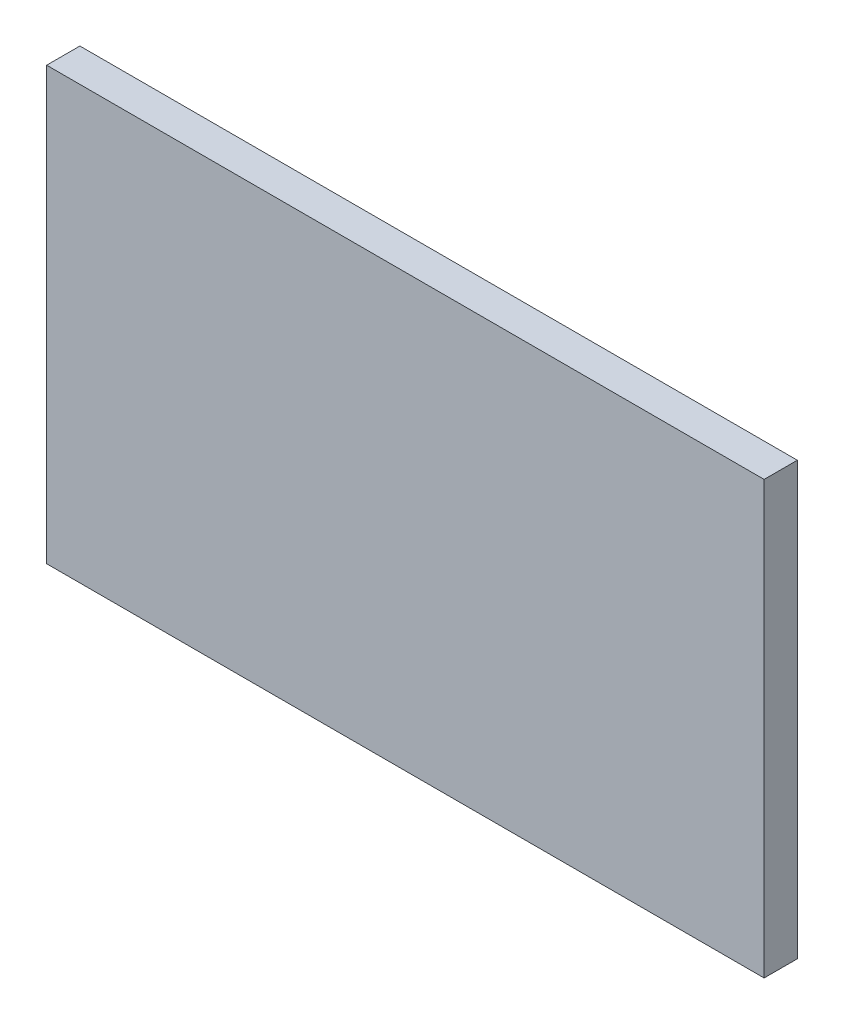
ISO-10303-21;
HEADER;
FILE_DESCRIPTION(('STEP AP214'),'2;1');
FILE_NAME('part.step','',(''),(''),'','','');
FILE_SCHEMA(('AUTOMOTIVE_DESIGN { 1 0 10303 214 1 1 1 1 }'));
ENDSEC;
DATA;
#1=APPLICATION_CONTEXT('core data for automotive mechanical design processes');
#2=APPLICATION_PROTOCOL_DEFINITION('international standard','automotive_design',2000,#1);
#3=PRODUCT_CONTEXT('',#1,'mechanical');
#4=PRODUCT('Part','Part','',(#3));
#5=PRODUCT_RELATED_PRODUCT_CATEGORY('part','',(#4));
#6=PRODUCT_DEFINITION_FORMATION('','',#4);
#7=PRODUCT_DEFINITION_CONTEXT('part definition',#1,'design');
#8=PRODUCT_DEFINITION('design','',#6,#7);
#9=PRODUCT_DEFINITION_SHAPE('','',#8);
#10=(LENGTH_UNIT() NAMED_UNIT(*) SI_UNIT(.MILLI.,.METRE.));
#11=(NAMED_UNIT(*) PLANE_ANGLE_UNIT() SI_UNIT($,.RADIAN.));
#12=(NAMED_UNIT(*) SI_UNIT($,.STERADIAN.) SOLID_ANGLE_UNIT());
#13=UNCERTAINTY_MEASURE_WITH_UNIT(LENGTH_MEASURE(1.E-05),#10,'distance_accuracy_value','');
#14=(GEOMETRIC_REPRESENTATION_CONTEXT(3) GLOBAL_UNCERTAINTY_ASSIGNED_CONTEXT((#13)) GLOBAL_UNIT_ASSIGNED_CONTEXT((#10,
#11,#12)) REPRESENTATION_CONTEXT('',''));
#15=CARTESIAN_POINT('',(0.,0.,0.));
#16=DIRECTION('',(0.,0.,1.));
#17=DIRECTION('',(1.,0.,0.));
#18=AXIS2_PLACEMENT_3D('',#15,#16,#17);
#19=CARTESIAN_POINT('',(-50.1141439205955,32.8287841191067,5.));
#20=DIRECTION('',(1.,0.,0.));
#21=DIRECTION('',(0.,1.,0.));
#22=AXIS2_PLACEMENT_3D('',#19,#20,#21);
#23=PLANE('',#22);
#24=DIRECTION('',(0.,-1.,0.));
#25=VECTOR('',#24,1.);
#26=CARTESIAN_POINT('',(-50.1141439205955,32.8287841191067,0.));
#27=LINE('',#26,#25);
#28=CARTESIAN_POINT('',(-50.1141439205955,32.8287841191067,0.));
#29=VERTEX_POINT('',#28);
#30=CARTESIAN_POINT('',(-50.1141439205955,-32.1712158808933,0.));
#31=VERTEX_POINT('',#30);
#32=EDGE_CURVE('E96',#29,#31,#27,.T.);
#33=ORIENTED_EDGE('',*,*,#32,.T.);
#34=DIRECTION('',(0.,0.,-1.));
#35=VECTOR('',#34,1.);
#36=CARTESIAN_POINT('',(-50.1141439205955,-32.1712158808933,5.));
#37=LINE('',#36,#35);
#38=CARTESIAN_POINT('',(-50.1141439205955,-32.1712158808933,5.));
#39=VERTEX_POINT('',#38);
#40=EDGE_CURVE('E11',#39,#31,#37,.T.);
#41=ORIENTED_EDGE('',*,*,#40,.F.);
#42=DIRECTION('',(0.,-1.,0.));
#43=VECTOR('',#42,1.);
#44=CARTESIAN_POINT('',(-50.1141439205955,32.8287841191067,5.));
#45=LINE('',#44,#43);
#46=CARTESIAN_POINT('',(-50.1141439205955,32.8287841191067,5.));
#47=VERTEX_POINT('',#46);
#48=EDGE_CURVE('E84',#47,#39,#45,.T.);
#49=ORIENTED_EDGE('',*,*,#48,.F.);
#50=DIRECTION('',(0.,0.,-1.));
#51=VECTOR('',#50,1.);
#52=CARTESIAN_POINT('',(-50.1141439205955,32.8287841191067,5.));
#53=LINE('',#52,#51);
#54=EDGE_CURVE('E92',#47,#29,#53,.T.);
#55=ORIENTED_EDGE('',*,*,#54,.T.);
#56=EDGE_LOOP('',(#33,#41,#49,#55));
#57=FACE_BOUND('',#56,.T.);
#58=ADVANCED_FACE('F33',(#57),#23,.F.);
#59=CARTESIAN_POINT('',(-50.1141439205955,-32.1712158808933,5.));
#60=DIRECTION('',(0.,1.,0.));
#61=DIRECTION('',(0.,0.,1.));
#62=AXIS2_PLACEMENT_3D('',#59,#60,#61);
#63=PLANE('',#62);
#64=DIRECTION('',(1.,0.,0.));
#65=VECTOR('',#64,1.);
#66=CARTESIAN_POINT('',(-50.1141439205955,-32.1712158808933,0.));
#67=LINE('',#66,#65);
#68=CARTESIAN_POINT('',(57.8858560794045,-32.1712158808933,0.));
#69=VERTEX_POINT('',#68);
#70=EDGE_CURVE('E88',#31,#69,#67,.T.);
#71=ORIENTED_EDGE('',*,*,#70,.T.);
#72=DIRECTION('',(0.,0.,-1.));
#73=VECTOR('',#72,1.);
#74=CARTESIAN_POINT('',(57.8858560794045,-32.1712158808933,5.));
#75=LINE('',#74,#73);
#76=CARTESIAN_POINT('',(57.8858560794045,-32.1712158808933,5.));
#77=VERTEX_POINT('',#76);
#78=EDGE_CURVE('E41',#77,#69,#75,.T.);
#79=ORIENTED_EDGE('',*,*,#78,.F.);
#80=DIRECTION('',(1.,0.,0.));
#81=VECTOR('',#80,1.);
#82=CARTESIAN_POINT('',(-50.1141439205955,-32.1712158808933,5.));
#83=LINE('',#82,#81);
#84=EDGE_CURVE('E79',#39,#77,#83,.T.);
#85=ORIENTED_EDGE('',*,*,#84,.F.);
#86=ORIENTED_EDGE('',*,*,#40,.T.);
#87=EDGE_LOOP('',(#71,#79,#85,#86));
#88=FACE_BOUND('',#87,.T.);
#89=ADVANCED_FACE('F87',(#88),#63,.F.);
#90=CARTESIAN_POINT('',(57.8858560794045,32.8287841191067,5.));
#91=DIRECTION('',(-1.,0.,0.));
#92=DIRECTION('',(0.,-1.,0.));
#93=AXIS2_PLACEMENT_3D('',#90,#91,#92);
#94=PLANE('',#93);
#95=DIRECTION('',(0.,1.,0.));
#96=VECTOR('',#95,1.);
#97=CARTESIAN_POINT('',(57.8858560794045,32.8287841191067,0.));
#98=LINE('',#97,#96);
#99=CARTESIAN_POINT('',(57.8858560794045,32.8287841191067,0.));
#100=VERTEX_POINT('',#99);
#101=EDGE_CURVE('E66',#69,#100,#98,.T.);
#102=ORIENTED_EDGE('',*,*,#101,.T.);
#103=DIRECTION('',(0.,0.,-1.));
#104=VECTOR('',#103,1.);
#105=CARTESIAN_POINT('',(57.8858560794045,32.8287841191067,5.));
#106=LINE('',#105,#104);
#107=CARTESIAN_POINT('',(57.8858560794045,32.8287841191067,5.));
#108=VERTEX_POINT('',#107);
#109=EDGE_CURVE('E89',#108,#100,#106,.T.);
#110=ORIENTED_EDGE('',*,*,#109,.F.);
#111=DIRECTION('',(0.,1.,0.));
#112=VECTOR('',#111,1.);
#113=CARTESIAN_POINT('',(57.8858560794045,32.8287841191067,5.));
#114=LINE('',#113,#112);
#115=EDGE_CURVE('E82',#77,#108,#114,.T.);
#116=ORIENTED_EDGE('',*,*,#115,.F.);
#117=ORIENTED_EDGE('',*,*,#78,.T.);
#118=EDGE_LOOP('',(#102,#110,#116,#117));
#119=FACE_BOUND('',#118,.T.);
#120=ADVANCED_FACE('F90',(#119),#94,.F.);
#121=CARTESIAN_POINT('',(-50.1141439205955,32.8287841191067,5.));
#122=DIRECTION('',(0.,-1.,0.));
#123=DIRECTION('',(0.,0.,-1.));
#124=AXIS2_PLACEMENT_3D('',#121,#122,#123);
#125=PLANE('',#124);
#126=DIRECTION('',(-1.,0.,0.));
#127=VECTOR('',#126,1.);
#128=CARTESIAN_POINT('',(-50.1141439205955,32.8287841191067,0.));
#129=LINE('',#128,#127);
#130=EDGE_CURVE('E72',#100,#29,#129,.T.);
#131=ORIENTED_EDGE('',*,*,#130,.T.);
#132=ORIENTED_EDGE('',*,*,#54,.F.);
#133=DIRECTION('',(-1.,0.,0.));
#134=VECTOR('',#133,1.);
#135=CARTESIAN_POINT('',(-50.1141439205955,32.8287841191067,5.));
#136=LINE('',#135,#134);
#137=EDGE_CURVE('E49',#108,#47,#136,.T.);
#138=ORIENTED_EDGE('',*,*,#137,.F.);
#139=ORIENTED_EDGE('',*,*,#109,.T.);
#140=EDGE_LOOP('',(#131,#132,#138,#139));
#141=FACE_BOUND('',#140,.T.);
#142=ADVANCED_FACE('F103',(#141),#125,.F.);
#143=CARTESIAN_POINT('',(0.,0.,5.));
#144=DIRECTION('',(0.,0.,1.));
#145=DIRECTION('',(1.,0.,0.));
#146=AXIS2_PLACEMENT_3D('',#143,#144,#145);
#147=PLANE('',#146);
#148=ORIENTED_EDGE('',*,*,#48,.T.);
#149=ORIENTED_EDGE('',*,*,#84,.T.);
#150=ORIENTED_EDGE('',*,*,#115,.T.);
#151=ORIENTED_EDGE('',*,*,#137,.T.);
#152=EDGE_LOOP('',(#148,#149,#150,#151));
#153=FACE_BOUND('',#152,.T.);
#154=ADVANCED_FACE('F80',(#153),#147,.T.);
#155=CARTESIAN_POINT('',(0.,0.,0.));
#156=DIRECTION('',(0.,0.,1.));
#157=DIRECTION('',(1.,0.,0.));
#158=AXIS2_PLACEMENT_3D('',#155,#156,#157);
#159=PLANE('',#158);
#160=ORIENTED_EDGE('',*,*,#32,.F.);
#161=ORIENTED_EDGE('',*,*,#130,.F.);
#162=ORIENTED_EDGE('',*,*,#101,.F.);
#163=ORIENTED_EDGE('',*,*,#70,.F.);
#164=EDGE_LOOP('',(#160,#161,#162,#163));
#165=FACE_BOUND('',#164,.T.);
#166=ADVANCED_FACE('F106',(#165),#159,.F.);
#167=CLOSED_SHELL('',(#58,#89,#120,#142,#154,#166));
#168=MANIFOLD_SOLID_BREP('B2',#167);
#169=ADVANCED_BREP_SHAPE_REPRESENTATION('',(#18,#168),#14);
#170=SHAPE_DEFINITION_REPRESENTATION(#9,#169);
ENDSEC;
END-ISO-10303-21;
